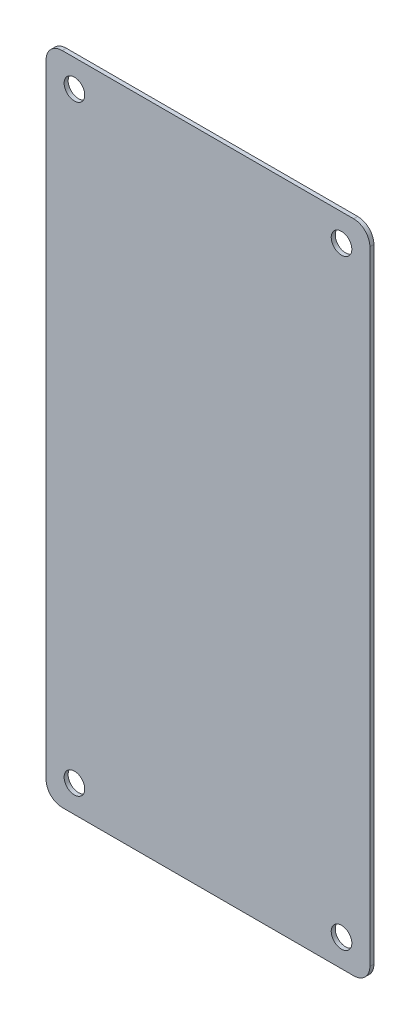
ISO-10303-21;
HEADER;
FILE_DESCRIPTION(('STEP AP214'),'2;1');
FILE_NAME('part.step','',(''),(''),'','','');
FILE_SCHEMA(('AUTOMOTIVE_DESIGN { 1 0 10303 214 1 1 1 1 }'));
ENDSEC;
DATA;
#1=APPLICATION_CONTEXT('core data for automotive mechanical design processes');
#2=APPLICATION_PROTOCOL_DEFINITION('international standard','automotive_design',2000,#1);
#3=PRODUCT_CONTEXT('',#1,'mechanical');
#4=PRODUCT('Part','Part','',(#3));
#5=PRODUCT_RELATED_PRODUCT_CATEGORY('part','',(#4));
#6=PRODUCT_DEFINITION_FORMATION('','',#4);
#7=PRODUCT_DEFINITION_CONTEXT('part definition',#1,'design');
#8=PRODUCT_DEFINITION('design','',#6,#7);
#9=PRODUCT_DEFINITION_SHAPE('','',#8);
#10=(LENGTH_UNIT() NAMED_UNIT(*) SI_UNIT(.MILLI.,.METRE.));
#11=(NAMED_UNIT(*) PLANE_ANGLE_UNIT() SI_UNIT($,.RADIAN.));
#12=(NAMED_UNIT(*) SI_UNIT($,.STERADIAN.) SOLID_ANGLE_UNIT());
#13=UNCERTAINTY_MEASURE_WITH_UNIT(LENGTH_MEASURE(1.E-05),#10,'distance_accuracy_value','');
#14=(GEOMETRIC_REPRESENTATION_CONTEXT(3) GLOBAL_UNCERTAINTY_ASSIGNED_CONTEXT((#13)) GLOBAL_UNIT_ASSIGNED_CONTEXT((#10,
#11,#12)) REPRESENTATION_CONTEXT('',''));
#15=CARTESIAN_POINT('',(0.,0.,0.));
#16=DIRECTION('',(0.,0.,1.));
#17=DIRECTION('',(1.,0.,0.));
#18=AXIS2_PLACEMENT_3D('',#15,#16,#17);
#19=CARTESIAN_POINT('',(40.,-81.,1.));
#20=DIRECTION('',(-1.,0.,0.));
#21=DIRECTION('',(0.,0.,1.));
#22=AXIS2_PLACEMENT_3D('',#19,#20,#21);
#23=PLANE('',#22);
#24=DIRECTION('',(0.,1.,0.));
#25=VECTOR('',#24,1.);
#26=CARTESIAN_POINT('',(40.,-81.,1.));
#27=LINE('',#26,#25);
#28=CARTESIAN_POINT('',(40.,-77.,1.));
#29=VERTEX_POINT('',#28);
#30=CARTESIAN_POINT('',(40.,77.,1.));
#31=VERTEX_POINT('',#30);
#32=EDGE_CURVE('E130',#29,#31,#27,.T.);
#33=ORIENTED_EDGE('',*,*,#32,.F.);
#34=DIRECTION('',(0.,0.,-1.));
#35=VECTOR('',#34,1.);
#36=CARTESIAN_POINT('',(40.,-77.,1.));
#37=LINE('',#36,#35);
#38=CARTESIAN_POINT('',(40.,-77.,0.));
#39=VERTEX_POINT('',#38);
#40=EDGE_CURVE('E11',#29,#39,#37,.T.);
#41=ORIENTED_EDGE('',*,*,#40,.T.);
#42=DIRECTION('',(0.,1.,0.));
#43=VECTOR('',#42,1.);
#44=CARTESIAN_POINT('',(40.,-81.,0.));
#45=LINE('',#44,#43);
#46=CARTESIAN_POINT('',(40.,77.,0.));
#47=VERTEX_POINT('',#46);
#48=EDGE_CURVE('E132',#39,#47,#45,.T.);
#49=ORIENTED_EDGE('',*,*,#48,.T.);
#50=DIRECTION('',(0.,0.,-1.));
#51=VECTOR('',#50,1.);
#52=CARTESIAN_POINT('',(40.,77.,1.));
#53=LINE('',#52,#51);
#54=EDGE_CURVE('E43',#47,#31,#53,.F.);
#55=ORIENTED_EDGE('',*,*,#54,.T.);
#56=EDGE_LOOP('',(#33,#41,#49,#55));
#57=FACE_BOUND('',#56,.T.);
#58=ADVANCED_FACE('F35',(#57),#23,.F.);
#59=CARTESIAN_POINT('',(-40.,81.,1.));
#60=DIRECTION('',(0.,-1.,0.));
#61=DIRECTION('',(0.,0.,-1.));
#62=AXIS2_PLACEMENT_3D('',#59,#60,#61);
#63=PLANE('',#62);
#64=DIRECTION('',(-1.,0.,0.));
#65=VECTOR('',#64,1.);
#66=CARTESIAN_POINT('',(-40.,81.,0.));
#67=LINE('',#66,#65);
#68=CARTESIAN_POINT('',(36.,81.,0.));
#69=VERTEX_POINT('',#68);
#70=CARTESIAN_POINT('',(-36.,81.,0.));
#71=VERTEX_POINT('',#70);
#72=EDGE_CURVE('E128',#69,#71,#67,.T.);
#73=ORIENTED_EDGE('',*,*,#72,.T.);
#74=DIRECTION('',(0.,0.,-1.));
#75=VECTOR('',#74,1.);
#76=CARTESIAN_POINT('',(-36.,81.,1.));
#77=LINE('',#76,#75);
#78=CARTESIAN_POINT('',(-36.,81.,1.));
#79=VERTEX_POINT('',#78);
#80=EDGE_CURVE('E107',#71,#79,#77,.F.);
#81=ORIENTED_EDGE('',*,*,#80,.T.);
#82=DIRECTION('',(-1.,0.,0.));
#83=VECTOR('',#82,1.);
#84=CARTESIAN_POINT('',(-40.,81.,1.));
#85=LINE('',#84,#83);
#86=CARTESIAN_POINT('',(36.,81.,1.));
#87=VERTEX_POINT('',#86);
#88=EDGE_CURVE('E168',#87,#79,#85,.T.);
#89=ORIENTED_EDGE('',*,*,#88,.F.);
#90=DIRECTION('',(0.,0.,-1.));
#91=VECTOR('',#90,1.);
#92=CARTESIAN_POINT('',(36.,81.,1.));
#93=LINE('',#92,#91);
#94=EDGE_CURVE('E112',#87,#69,#93,.T.);
#95=ORIENTED_EDGE('',*,*,#94,.T.);
#96=EDGE_LOOP('',(#73,#81,#89,#95));
#97=FACE_BOUND('',#96,.T.);
#98=ADVANCED_FACE('F172',(#97),#63,.F.);
#99=CARTESIAN_POINT('',(-40.,-81.,1.));
#100=DIRECTION('',(1.,0.,0.));
#101=DIRECTION('',(0.,0.,-1.));
#102=AXIS2_PLACEMENT_3D('',#99,#100,#101);
#103=PLANE('',#102);
#104=DIRECTION('',(0.,-1.,0.));
#105=VECTOR('',#104,1.);
#106=CARTESIAN_POINT('',(-40.,-81.,1.));
#107=LINE('',#106,#105);
#108=CARTESIAN_POINT('',(-40.,77.,1.));
#109=VERTEX_POINT('',#108);
#110=CARTESIAN_POINT('',(-40.,-77.,1.));
#111=VERTEX_POINT('',#110);
#112=EDGE_CURVE('E121',#109,#111,#107,.T.);
#113=ORIENTED_EDGE('',*,*,#112,.F.);
#114=DIRECTION('',(0.,0.,-1.));
#115=VECTOR('',#114,1.);
#116=CARTESIAN_POINT('',(-40.,77.,1.));
#117=LINE('',#116,#115);
#118=CARTESIAN_POINT('',(-40.,77.,0.));
#119=VERTEX_POINT('',#118);
#120=EDGE_CURVE('E106',#109,#119,#117,.T.);
#121=ORIENTED_EDGE('',*,*,#120,.T.);
#122=DIRECTION('',(0.,-1.,0.));
#123=VECTOR('',#122,1.);
#124=CARTESIAN_POINT('',(-40.,-81.,0.));
#125=LINE('',#124,#123);
#126=CARTESIAN_POINT('',(-40.,-77.,0.));
#127=VERTEX_POINT('',#126);
#128=EDGE_CURVE('E119',#119,#127,#125,.T.);
#129=ORIENTED_EDGE('',*,*,#128,.T.);
#130=DIRECTION('',(0.,0.,-1.));
#131=VECTOR('',#130,1.);
#132=CARTESIAN_POINT('',(-40.,-77.,1.));
#133=LINE('',#132,#131);
#134=EDGE_CURVE('E123',#127,#111,#133,.F.);
#135=ORIENTED_EDGE('',*,*,#134,.T.);
#136=EDGE_LOOP('',(#113,#121,#129,#135));
#137=FACE_BOUND('',#136,.T.);
#138=ADVANCED_FACE('F118',(#137),#103,.F.);
#139=CARTESIAN_POINT('',(-40.,-81.,1.));
#140=DIRECTION('',(0.,1.,0.));
#141=DIRECTION('',(0.,0.,1.));
#142=AXIS2_PLACEMENT_3D('',#139,#140,#141);
#143=PLANE('',#142);
#144=DIRECTION('',(1.,0.,0.));
#145=VECTOR('',#144,1.);
#146=CARTESIAN_POINT('',(-40.,-81.,1.));
#147=LINE('',#146,#145);
#148=CARTESIAN_POINT('',(-36.,-81.,1.));
#149=VERTEX_POINT('',#148);
#150=CARTESIAN_POINT('',(36.,-81.,1.));
#151=VERTEX_POINT('',#150);
#152=EDGE_CURVE('E136',#149,#151,#147,.T.);
#153=ORIENTED_EDGE('',*,*,#152,.F.);
#154=DIRECTION('',(0.,0.,-1.));
#155=VECTOR('',#154,1.);
#156=CARTESIAN_POINT('',(-36.,-81.,1.));
#157=LINE('',#156,#155);
#158=CARTESIAN_POINT('',(-36.,-81.,0.));
#159=VERTEX_POINT('',#158);
#160=EDGE_CURVE('E153',#149,#159,#157,.T.);
#161=ORIENTED_EDGE('',*,*,#160,.T.);
#162=DIRECTION('',(1.,0.,0.));
#163=VECTOR('',#162,1.);
#164=CARTESIAN_POINT('',(-40.,-81.,0.));
#165=LINE('',#164,#163);
#166=CARTESIAN_POINT('',(36.,-81.,0.));
#167=VERTEX_POINT('',#166);
#168=EDGE_CURVE('E127',#159,#167,#165,.T.);
#169=ORIENTED_EDGE('',*,*,#168,.T.);
#170=DIRECTION('',(0.,0.,-1.));
#171=VECTOR('',#170,1.);
#172=CARTESIAN_POINT('',(36.,-81.,1.));
#173=LINE('',#172,#171);
#174=EDGE_CURVE('E50',#167,#151,#173,.F.);
#175=ORIENTED_EDGE('',*,*,#174,.T.);
#176=EDGE_LOOP('',(#153,#161,#169,#175));
#177=FACE_BOUND('',#176,.T.);
#178=ADVANCED_FACE('F261',(#177),#143,.F.);
#179=CARTESIAN_POINT('',(0.,0.,1.));
#180=DIRECTION('',(0.,0.,-1.));
#181=DIRECTION('',(-1.,0.,0.));
#182=AXIS2_PLACEMENT_3D('',#179,#180,#181);
#183=PLANE('',#182);
#184=CARTESIAN_POINT('',(-33.,-74.25,1.));
#185=DIRECTION('',(0.,0.,-1.));
#186=DIRECTION('',(-1.,0.,0.));
#187=AXIS2_PLACEMENT_3D('',#184,#185,#186);
#188=CIRCLE('',#187,2.55);
#189=CARTESIAN_POINT('',(-35.55,-74.25,1.));
#190=VERTEX_POINT('',#189);
#191=EDGE_CURVE('E187',#190,#190,#188,.T.);
#192=ORIENTED_EDGE('',*,*,#191,.T.);
#193=EDGE_LOOP('',(#192));
#194=FACE_BOUND('',#193,.T.);
#195=CARTESIAN_POINT('',(-33.,74.25,1.));
#196=DIRECTION('',(0.,0.,-1.));
#197=DIRECTION('',(-1.,0.,0.));
#198=AXIS2_PLACEMENT_3D('',#195,#196,#197);
#199=CIRCLE('',#198,2.55);
#200=CARTESIAN_POINT('',(-35.55,74.25,1.));
#201=VERTEX_POINT('',#200);
#202=EDGE_CURVE('E193',#201,#201,#199,.T.);
#203=ORIENTED_EDGE('',*,*,#202,.T.);
#204=EDGE_LOOP('',(#203));
#205=FACE_BOUND('',#204,.T.);
#206=CARTESIAN_POINT('',(33.,74.25,1.));
#207=DIRECTION('',(0.,0.,-1.));
#208=DIRECTION('',(-1.,0.,0.));
#209=AXIS2_PLACEMENT_3D('',#206,#207,#208);
#210=CIRCLE('',#209,2.54999999999999);
#211=CARTESIAN_POINT('',(30.45,74.25,1.));
#212=VERTEX_POINT('',#211);
#213=EDGE_CURVE('E182',#212,#212,#210,.T.);
#214=ORIENTED_EDGE('',*,*,#213,.T.);
#215=EDGE_LOOP('',(#214));
#216=FACE_BOUND('',#215,.T.);
#217=CARTESIAN_POINT('',(33.,-74.25,1.));
#218=DIRECTION('',(0.,0.,-1.));
#219=DIRECTION('',(-1.,0.,0.));
#220=AXIS2_PLACEMENT_3D('',#217,#218,#219);
#221=CIRCLE('',#220,2.54999999999999);
#222=CARTESIAN_POINT('',(30.45,-74.25,1.));
#223=VERTEX_POINT('',#222);
#224=EDGE_CURVE('E173',#223,#223,#221,.T.);
#225=ORIENTED_EDGE('',*,*,#224,.T.);
#226=EDGE_LOOP('',(#225));
#227=FACE_BOUND('',#226,.T.);
#228=ORIENTED_EDGE('',*,*,#88,.T.);
#229=CARTESIAN_POINT('',(-36.,77.,1.));
#230=DIRECTION('',(0.,0.,-1.));
#231=DIRECTION('',(-1.,0.,0.));
#232=AXIS2_PLACEMENT_3D('',#229,#230,#231);
#233=CIRCLE('',#232,4.);
#234=EDGE_CURVE('E150',#79,#109,#233,.F.);
#235=ORIENTED_EDGE('',*,*,#234,.T.);
#236=ORIENTED_EDGE('',*,*,#112,.T.);
#237=CARTESIAN_POINT('',(-36.,-77.,1.));
#238=DIRECTION('',(0.,0.,-1.));
#239=DIRECTION('',(-1.,0.,0.));
#240=AXIS2_PLACEMENT_3D('',#237,#238,#239);
#241=CIRCLE('',#240,4.);
#242=EDGE_CURVE('E57',#111,#149,#241,.F.);
#243=ORIENTED_EDGE('',*,*,#242,.T.);
#244=ORIENTED_EDGE('',*,*,#152,.T.);
#245=CARTESIAN_POINT('',(36.,-77.,1.));
#246=DIRECTION('',(0.,0.,-1.));
#247=DIRECTION('',(-1.,0.,0.));
#248=AXIS2_PLACEMENT_3D('',#245,#246,#247);
#249=CIRCLE('',#248,4.);
#250=EDGE_CURVE('E147',#151,#29,#249,.F.);
#251=ORIENTED_EDGE('',*,*,#250,.T.);
#252=ORIENTED_EDGE('',*,*,#32,.T.);
#253=CARTESIAN_POINT('',(36.,77.,1.));
#254=DIRECTION('',(0.,0.,-1.));
#255=DIRECTION('',(-1.,0.,0.));
#256=AXIS2_PLACEMENT_3D('',#253,#254,#255);
#257=CIRCLE('',#256,4.);
#258=EDGE_CURVE('E145',#31,#87,#257,.F.);
#259=ORIENTED_EDGE('',*,*,#258,.T.);
#260=EDGE_LOOP('',(#228,#235,#236,#243,#244,#251,#252,#259));
#261=FACE_BOUND('',#260,.T.);
#262=ADVANCED_FACE('F165',(#194,#205,#216,#227,#261),#183,.F.);
#263=CARTESIAN_POINT('',(0.,0.,0.));
#264=DIRECTION('',(0.,0.,-1.));
#265=DIRECTION('',(-1.,0.,0.));
#266=AXIS2_PLACEMENT_3D('',#263,#264,#265);
#267=PLANE('',#266);
#268=CARTESIAN_POINT('',(-33.,-74.25,0.));
#269=DIRECTION('',(0.,0.,-1.));
#270=DIRECTION('',(-1.,0.,0.));
#271=AXIS2_PLACEMENT_3D('',#268,#269,#270);
#272=CIRCLE('',#271,2.55);
#273=CARTESIAN_POINT('',(-35.55,-74.25,0.));
#274=VERTEX_POINT('',#273);
#275=EDGE_CURVE('E184',#274,#274,#272,.T.);
#276=ORIENTED_EDGE('',*,*,#275,.F.);
#277=EDGE_LOOP('',(#276));
#278=FACE_BOUND('',#277,.T.);
#279=CARTESIAN_POINT('',(-33.,74.25,0.));
#280=DIRECTION('',(0.,0.,-1.));
#281=DIRECTION('',(-1.,0.,0.));
#282=AXIS2_PLACEMENT_3D('',#279,#280,#281);
#283=CIRCLE('',#282,2.55);
#284=CARTESIAN_POINT('',(-35.55,74.25,0.));
#285=VERTEX_POINT('',#284);
#286=EDGE_CURVE('E190',#285,#285,#283,.T.);
#287=ORIENTED_EDGE('',*,*,#286,.F.);
#288=EDGE_LOOP('',(#287));
#289=FACE_BOUND('',#288,.T.);
#290=CARTESIAN_POINT('',(33.,74.25,0.));
#291=DIRECTION('',(0.,0.,-1.));
#292=DIRECTION('',(-1.,0.,0.));
#293=AXIS2_PLACEMENT_3D('',#290,#291,#292);
#294=CIRCLE('',#293,2.54999999999999);
#295=CARTESIAN_POINT('',(30.45,74.25,0.));
#296=VERTEX_POINT('',#295);
#297=EDGE_CURVE('E196',#296,#296,#294,.T.);
#298=ORIENTED_EDGE('',*,*,#297,.F.);
#299=EDGE_LOOP('',(#298));
#300=FACE_BOUND('',#299,.T.);
#301=CARTESIAN_POINT('',(33.,-74.25,0.));
#302=DIRECTION('',(0.,0.,-1.));
#303=DIRECTION('',(-1.,0.,0.));
#304=AXIS2_PLACEMENT_3D('',#301,#302,#303);
#305=CIRCLE('',#304,2.54999999999999);
#306=CARTESIAN_POINT('',(30.45,-74.25,0.));
#307=VERTEX_POINT('',#306);
#308=EDGE_CURVE('E175',#307,#307,#305,.T.);
#309=ORIENTED_EDGE('',*,*,#308,.F.);
#310=EDGE_LOOP('',(#309));
#311=FACE_BOUND('',#310,.T.);
#312=ORIENTED_EDGE('',*,*,#128,.F.);
#313=CARTESIAN_POINT('',(-36.,77.,0.));
#314=DIRECTION('',(0.,0.,-1.));
#315=DIRECTION('',(-1.,0.,0.));
#316=AXIS2_PLACEMENT_3D('',#313,#314,#315);
#317=CIRCLE('',#316,4.);
#318=EDGE_CURVE('E102',#119,#71,#317,.T.);
#319=ORIENTED_EDGE('',*,*,#318,.T.);
#320=ORIENTED_EDGE('',*,*,#72,.F.);
#321=CARTESIAN_POINT('',(36.,77.,0.));
#322=DIRECTION('',(0.,0.,-1.));
#323=DIRECTION('',(-1.,0.,0.));
#324=AXIS2_PLACEMENT_3D('',#321,#322,#323);
#325=CIRCLE('',#324,4.);
#326=EDGE_CURVE('E122',#69,#47,#325,.T.);
#327=ORIENTED_EDGE('',*,*,#326,.T.);
#328=ORIENTED_EDGE('',*,*,#48,.F.);
#329=CARTESIAN_POINT('',(36.,-77.,0.));
#330=DIRECTION('',(0.,0.,-1.));
#331=DIRECTION('',(-1.,0.,0.));
#332=AXIS2_PLACEMENT_3D('',#329,#330,#331);
#333=CIRCLE('',#332,4.);
#334=EDGE_CURVE('E139',#39,#167,#333,.T.);
#335=ORIENTED_EDGE('',*,*,#334,.T.);
#336=ORIENTED_EDGE('',*,*,#168,.F.);
#337=CARTESIAN_POINT('',(-36.,-77.,0.));
#338=DIRECTION('',(0.,0.,-1.));
#339=DIRECTION('',(-1.,0.,0.));
#340=AXIS2_PLACEMENT_3D('',#337,#338,#339);
#341=CIRCLE('',#340,4.);
#342=EDGE_CURVE('E113',#159,#127,#341,.T.);
#343=ORIENTED_EDGE('',*,*,#342,.T.);
#344=EDGE_LOOP('',(#312,#319,#320,#327,#328,#335,#336,#343));
#345=FACE_BOUND('',#344,.T.);
#346=ADVANCED_FACE('F125',(#278,#289,#300,#311,#345),#267,.T.);
#347=CARTESIAN_POINT('',(-36.,77.,1.));
#348=DIRECTION('',(0.,0.,-1.));
#349=DIRECTION('',(-1.,0.,0.));
#350=AXIS2_PLACEMENT_3D('',#347,#348,#349);
#351=CYLINDRICAL_SURFACE('',#350,4.);
#352=ORIENTED_EDGE('',*,*,#234,.F.);
#353=ORIENTED_EDGE('',*,*,#80,.F.);
#354=ORIENTED_EDGE('',*,*,#318,.F.);
#355=ORIENTED_EDGE('',*,*,#120,.F.);
#356=EDGE_LOOP('',(#352,#353,#354,#355));
#357=FACE_BOUND('',#356,.T.);
#358=ADVANCED_FACE('F105',(#357),#351,.T.);
#359=CARTESIAN_POINT('',(-36.,-77.,1.));
#360=DIRECTION('',(0.,0.,-1.));
#361=DIRECTION('',(-1.,0.,0.));
#362=AXIS2_PLACEMENT_3D('',#359,#360,#361);
#363=CYLINDRICAL_SURFACE('',#362,4.);
#364=ORIENTED_EDGE('',*,*,#242,.F.);
#365=ORIENTED_EDGE('',*,*,#134,.F.);
#366=ORIENTED_EDGE('',*,*,#342,.F.);
#367=ORIENTED_EDGE('',*,*,#160,.F.);
#368=EDGE_LOOP('',(#364,#365,#366,#367));
#369=FACE_BOUND('',#368,.T.);
#370=ADVANCED_FACE('F238',(#369),#363,.T.);
#371=CARTESIAN_POINT('',(36.,-77.,1.));
#372=DIRECTION('',(0.,0.,-1.));
#373=DIRECTION('',(-1.,0.,0.));
#374=AXIS2_PLACEMENT_3D('',#371,#372,#373);
#375=CYLINDRICAL_SURFACE('',#374,4.);
#376=ORIENTED_EDGE('',*,*,#250,.F.);
#377=ORIENTED_EDGE('',*,*,#174,.F.);
#378=ORIENTED_EDGE('',*,*,#334,.F.);
#379=ORIENTED_EDGE('',*,*,#40,.F.);
#380=EDGE_LOOP('',(#376,#377,#378,#379));
#381=FACE_BOUND('',#380,.T.);
#382=ADVANCED_FACE('F224',(#381),#375,.T.);
#383=CARTESIAN_POINT('',(36.,77.,1.));
#384=DIRECTION('',(0.,0.,-1.));
#385=DIRECTION('',(-1.,0.,0.));
#386=AXIS2_PLACEMENT_3D('',#383,#384,#385);
#387=CYLINDRICAL_SURFACE('',#386,4.);
#388=ORIENTED_EDGE('',*,*,#258,.F.);
#389=ORIENTED_EDGE('',*,*,#54,.F.);
#390=ORIENTED_EDGE('',*,*,#326,.F.);
#391=ORIENTED_EDGE('',*,*,#94,.F.);
#392=EDGE_LOOP('',(#388,#389,#390,#391));
#393=FACE_BOUND('',#392,.T.);
#394=ADVANCED_FACE('F37',(#393),#387,.T.);
#395=CARTESIAN_POINT('',(33.,-74.25,1.));
#396=DIRECTION('',(0.,0.,-1.));
#397=DIRECTION('',(-1.,0.,0.));
#398=AXIS2_PLACEMENT_3D('',#395,#396,#397);
#399=CYLINDRICAL_SURFACE('',#398,2.54999999999999);
#400=ORIENTED_EDGE('',*,*,#224,.F.);
#401=EDGE_LOOP('',(#400));
#402=FACE_BOUND('',#401,.T.);
#403=ORIENTED_EDGE('',*,*,#308,.T.);
#404=EDGE_LOOP('',(#403));
#405=FACE_BOUND('',#404,.T.);
#406=ADVANCED_FACE('F208',(#402,#405),#399,.F.);
#407=CARTESIAN_POINT('',(33.,74.25,1.));
#408=DIRECTION('',(0.,0.,-1.));
#409=DIRECTION('',(-1.,0.,0.));
#410=AXIS2_PLACEMENT_3D('',#407,#408,#409);
#411=CYLINDRICAL_SURFACE('',#410,2.54999999999999);
#412=ORIENTED_EDGE('',*,*,#213,.F.);
#413=EDGE_LOOP('',(#412));
#414=FACE_BOUND('',#413,.T.);
#415=ORIENTED_EDGE('',*,*,#297,.T.);
#416=EDGE_LOOP('',(#415));
#417=FACE_BOUND('',#416,.T.);
#418=ADVANCED_FACE('F204',(#414,#417),#411,.F.);
#419=CARTESIAN_POINT('',(-33.,74.25,1.));
#420=DIRECTION('',(0.,0.,-1.));
#421=DIRECTION('',(-1.,0.,0.));
#422=AXIS2_PLACEMENT_3D('',#419,#420,#421);
#423=CYLINDRICAL_SURFACE('',#422,2.55);
#424=ORIENTED_EDGE('',*,*,#202,.F.);
#425=EDGE_LOOP('',(#424));
#426=FACE_BOUND('',#425,.T.);
#427=ORIENTED_EDGE('',*,*,#286,.T.);
#428=EDGE_LOOP('',(#427));
#429=FACE_BOUND('',#428,.T.);
#430=ADVANCED_FACE('F207',(#426,#429),#423,.F.);
#431=CARTESIAN_POINT('',(-33.,-74.25,1.));
#432=DIRECTION('',(0.,0.,-1.));
#433=DIRECTION('',(-1.,0.,0.));
#434=AXIS2_PLACEMENT_3D('',#431,#432,#433);
#435=CYLINDRICAL_SURFACE('',#434,2.55);
#436=ORIENTED_EDGE('',*,*,#191,.F.);
#437=EDGE_LOOP('',(#436));
#438=FACE_BOUND('',#437,.T.);
#439=ORIENTED_EDGE('',*,*,#275,.T.);
#440=EDGE_LOOP('',(#439));
#441=FACE_BOUND('',#440,.T.);
#442=ADVANCED_FACE('F288',(#438,#441),#435,.F.);
#443=CLOSED_SHELL('',(#58,#98,#138,#178,#262,#346,#358,#370,#382,#394,#406,#418,#430,#442));
#444=MANIFOLD_SOLID_BREP('B2',#443);
#445=ADVANCED_BREP_SHAPE_REPRESENTATION('',(#18,#444),#14);
#446=SHAPE_DEFINITION_REPRESENTATION(#9,#445);
ENDSEC;
END-ISO-10303-21;
